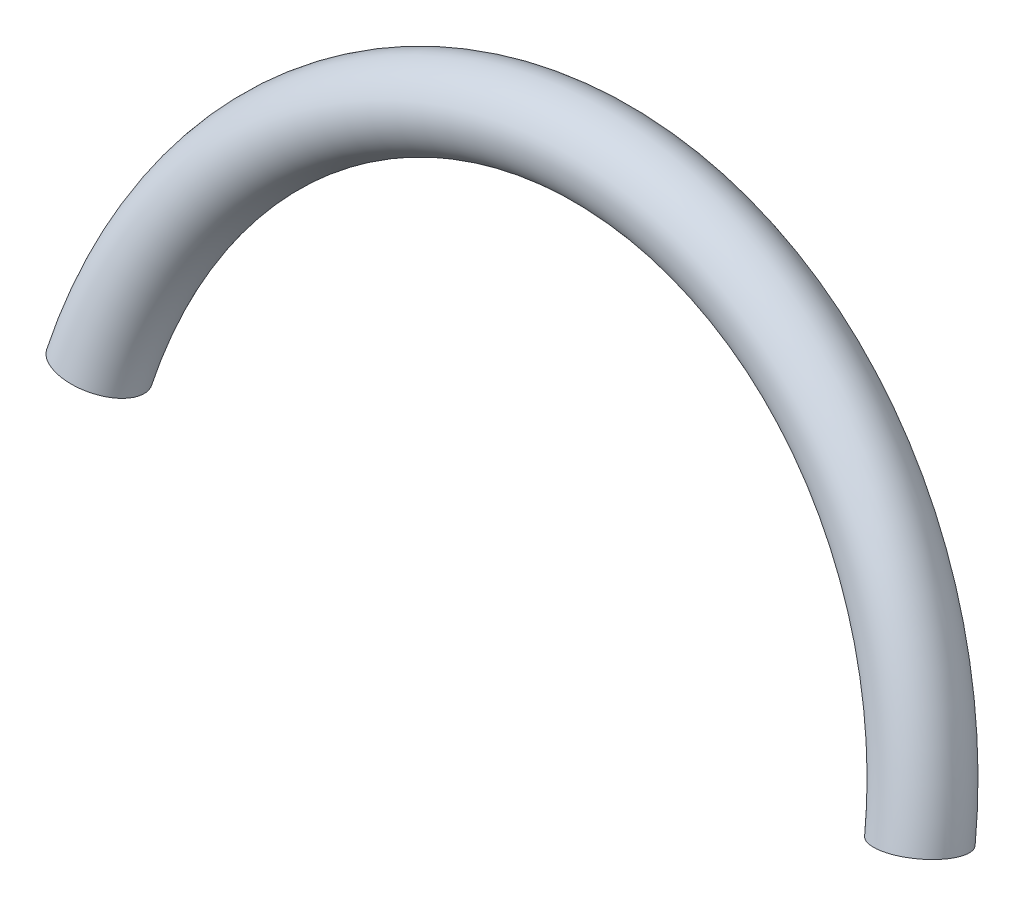
ISO-10303-21;
HEADER;
FILE_DESCRIPTION(('STEP AP214'),'2;1');
FILE_NAME('part.step','',(''),(''),'','','');
FILE_SCHEMA(('AUTOMOTIVE_DESIGN { 1 0 10303 214 1 1 1 1 }'));
ENDSEC;
DATA;
#1=APPLICATION_CONTEXT('core data for automotive mechanical design processes');
#2=APPLICATION_PROTOCOL_DEFINITION('international standard','automotive_design',2000,#1);
#3=PRODUCT_CONTEXT('',#1,'mechanical');
#4=PRODUCT('Part','Part','',(#3));
#5=PRODUCT_RELATED_PRODUCT_CATEGORY('part','',(#4));
#6=PRODUCT_DEFINITION_FORMATION('','',#4);
#7=PRODUCT_DEFINITION_CONTEXT('part definition',#1,'design');
#8=PRODUCT_DEFINITION('design','',#6,#7);
#9=PRODUCT_DEFINITION_SHAPE('','',#8);
#10=(LENGTH_UNIT() NAMED_UNIT(*) SI_UNIT(.MILLI.,.METRE.));
#11=(NAMED_UNIT(*) PLANE_ANGLE_UNIT() SI_UNIT($,.RADIAN.));
#12=(NAMED_UNIT(*) SI_UNIT($,.STERADIAN.) SOLID_ANGLE_UNIT());
#13=UNCERTAINTY_MEASURE_WITH_UNIT(LENGTH_MEASURE(1.E-05),#10,'distance_accuracy_value','');
#14=(GEOMETRIC_REPRESENTATION_CONTEXT(3) GLOBAL_UNCERTAINTY_ASSIGNED_CONTEXT((#13)) GLOBAL_UNIT_ASSIGNED_CONTEXT((#10,
#11,#12)) REPRESENTATION_CONTEXT('',''));
#15=CARTESIAN_POINT('',(0.,0.,0.));
#16=DIRECTION('',(0.,0.,1.));
#17=DIRECTION('',(1.,0.,0.));
#18=AXIS2_PLACEMENT_3D('',#15,#16,#17);
#19=CARTESIAN_POINT('',(0.,904.255410655569,-1942.29450703663));
#20=DIRECTION('',(0.,-0.258819045102518,-0.965925826289069));
#21=DIRECTION('',(0.,0.965925826289069,-0.258819045102518));
#22=AXIS2_PLACEMENT_3D('',#19,#20,#21);
#23=TOROIDAL_SURFACE('',#22,116.149429379517,9.39999999999998);
#24=CARTESIAN_POINT('',(-115.,920.,-1946.51325703663));
#25=DIRECTION('',(-0.140336447675245,-0.956366902675757,0.25625773923976));
#26=DIRECTION('',(0.,-0.258819045102461,-0.965925826289084));
#27=AXIS2_PLACEMENT_3D('',#24,#25,#26);
#28=CIRCLE('',#27,9.39999999999998);
#29=CARTESIAN_POINT('',(-124.306976416284,921.274213232284,-1946.85468144321));
#30=VERTEX_POINT('',#29);
#31=EDGE_CURVE('E49',#30,#30,#28,.T.);
#32=CARTESIAN_POINT('',(115.,920.,-1946.51325703663));
#33=DIRECTION('',(0.140336447675245,-0.956366902675727,0.256257739239872));
#34=DIRECTION('',(0.,-0.258819045102574,-0.965925826289054));
#35=AXIS2_PLACEMENT_3D('',#32,#33,#34);
#36=CIRCLE('',#35,9.39999999999998);
#37=CARTESIAN_POINT('',(124.306976416284,921.274213232284,-1946.85468144321));
#38=VERTEX_POINT('',#37);
#39=EDGE_CURVE('E10',#38,#38,#36,.T.);
#40=CARTESIAN_POINT('',(0.,904.255410655569,-1942.29450703663));
#41=DIRECTION('',(0.,-0.258819045102518,-0.965925826289069));
#42=DIRECTION('',(0.,0.965925826289069,-0.258819045102518));
#43=AXIS2_PLACEMENT_3D('',#40,#41,#42);
#44=CIRCLE('',#43,125.549429379517);
#45=EDGE_CURVE('',#30,#38,#44,.T.);
#46=ORIENTED_EDGE('',*,*,#31,.T.);
#47=ORIENTED_EDGE('',*,*,#39,.T.);
#48=ORIENTED_EDGE('',*,*,#45,.T.);
#49=ORIENTED_EDGE('',*,*,#45,.F.);
#50=EDGE_LOOP('',(#46,#48,#47,#49));
#51=FACE_BOUND('',#50,.T.);
#52=ADVANCED_FACE('F39',(#51),#23,.F.);
#53=CARTESIAN_POINT('',(115.,920.,-1946.51325703663));
#54=DIRECTION('',(0.140336447675245,-0.956366902675727,0.256257739239872));
#55=DIRECTION('',(0.,-0.258819045102574,-0.965925826289054));
#56=AXIS2_PLACEMENT_3D('',#53,#54,#55);
#57=PLANE('',#56);
#58=ORIENTED_EDGE('',*,*,#39,.F.);
#59=EDGE_LOOP('',(#58));
#60=FACE_BOUND('',#59,.T.);
#61=CARTESIAN_POINT('',(115.,920.,-1946.51325703663));
#62=DIRECTION('',(0.140336447675245,-0.956366902675727,0.256257739239872));
#63=DIRECTION('',(0.,-0.258819045102574,-0.965925826289054));
#64=AXIS2_PLACEMENT_3D('',#61,#62,#63);
#65=CIRCLE('',#64,11.);
#66=CARTESIAN_POINT('',(125.891142614801,921.491100590971,-1946.91279623581));
#67=VERTEX_POINT('',#66);
#68=EDGE_CURVE('E45',#67,#67,#65,.F.);
#69=ORIENTED_EDGE('',*,*,#68,.F.);
#70=EDGE_LOOP('',(#69));
#71=FACE_BOUND('',#70,.T.);
#72=ADVANCED_FACE('F69',(#60,#71),#57,.T.);
#73=CARTESIAN_POINT('',(0.,904.255410655569,-1942.29450703663));
#74=DIRECTION('',(0.,-0.258819045102518,-0.965925826289069));
#75=DIRECTION('',(0.,0.965925826289069,-0.258819045102518));
#76=AXIS2_PLACEMENT_3D('',#73,#74,#75);
#77=TOROIDAL_SURFACE('',#76,116.149429379517,11.);
#78=CARTESIAN_POINT('',(-115.,920.,-1946.51325703663));
#79=DIRECTION('',(-0.140336447675245,-0.956366902675757,0.25625773923976));
#80=DIRECTION('',(0.,-0.258819045102461,-0.965925826289084));
#81=AXIS2_PLACEMENT_3D('',#78,#79,#80);
#82=CIRCLE('',#81,11.);
#83=CARTESIAN_POINT('',(-125.891142614801,921.491100590971,-1946.91279623581));
#84=VERTEX_POINT('',#83);
#85=EDGE_CURVE('E53',#84,#84,#82,.F.);
#86=CARTESIAN_POINT('',(0.,904.255410655569,-1942.29450703663));
#87=DIRECTION('',(0.,-0.258819045102518,-0.965925826289069));
#88=DIRECTION('',(0.,0.965925826289069,-0.258819045102518));
#89=AXIS2_PLACEMENT_3D('',#86,#87,#88);
#90=CIRCLE('',#89,127.149429379517);
#91=EDGE_CURVE('',#84,#67,#90,.T.);
#92=ORIENTED_EDGE('',*,*,#85,.T.);
#93=ORIENTED_EDGE('',*,*,#68,.T.);
#94=ORIENTED_EDGE('',*,*,#91,.T.);
#95=ORIENTED_EDGE('',*,*,#91,.F.);
#96=EDGE_LOOP('',(#92,#94,#93,#95));
#97=FACE_BOUND('',#96,.T.);
#98=ADVANCED_FACE('F59',(#97),#77,.T.);
#99=CARTESIAN_POINT('',(-115.,920.,-1946.51325703663));
#100=DIRECTION('',(-0.140336447675245,-0.956366902675757,0.25625773923976));
#101=DIRECTION('',(0.,-0.258819045102461,-0.965925826289084));
#102=AXIS2_PLACEMENT_3D('',#99,#100,#101);
#103=PLANE('',#102);
#104=ORIENTED_EDGE('',*,*,#31,.F.);
#105=EDGE_LOOP('',(#104));
#106=FACE_BOUND('',#105,.T.);
#107=ORIENTED_EDGE('',*,*,#85,.F.);
#108=EDGE_LOOP('',(#107));
#109=FACE_BOUND('',#108,.T.);
#110=ADVANCED_FACE('F61',(#106,#109),#103,.T.);
#111=CLOSED_SHELL('',(#52,#72,#98,#110));
#112=MANIFOLD_SOLID_BREP('B2',#111);
#113=ADVANCED_BREP_SHAPE_REPRESENTATION('',(#18,#112),#14);
#114=SHAPE_DEFINITION_REPRESENTATION(#9,#113);
ENDSEC;
END-ISO-10303-21;
